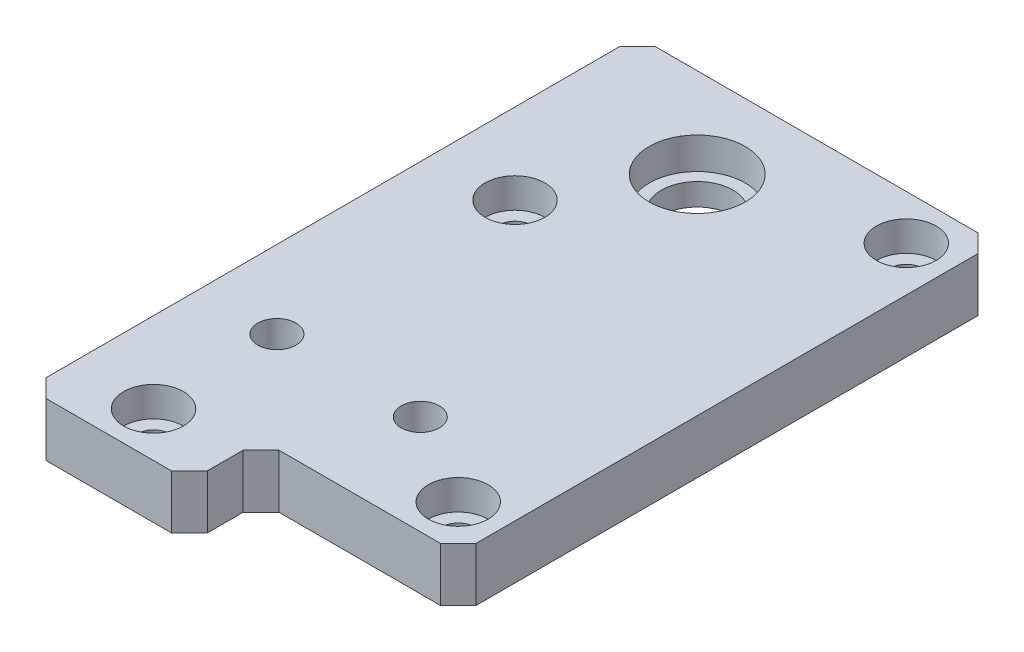
ISO-10303-21;
HEADER;
FILE_DESCRIPTION(('STEP AP214'),'2;1');
FILE_NAME('part.step','',(''),(''),'','','');
FILE_SCHEMA(('AUTOMOTIVE_DESIGN { 1 0 10303 214 1 1 1 1 }'));
ENDSEC;
DATA;
#1=APPLICATION_CONTEXT('core data for automotive mechanical design processes');
#2=APPLICATION_PROTOCOL_DEFINITION('international standard','automotive_design',2000,#1);
#3=PRODUCT_CONTEXT('',#1,'mechanical');
#4=PRODUCT('Part','Part','',(#3));
#5=PRODUCT_RELATED_PRODUCT_CATEGORY('part','',(#4));
#6=PRODUCT_DEFINITION_FORMATION('','',#4);
#7=PRODUCT_DEFINITION_CONTEXT('part definition',#1,'design');
#8=PRODUCT_DEFINITION('design','',#6,#7);
#9=PRODUCT_DEFINITION_SHAPE('','',#8);
#10=(LENGTH_UNIT() NAMED_UNIT(*) SI_UNIT(.MILLI.,.METRE.));
#11=(NAMED_UNIT(*) PLANE_ANGLE_UNIT() SI_UNIT($,.RADIAN.));
#12=(NAMED_UNIT(*) SI_UNIT($,.STERADIAN.) SOLID_ANGLE_UNIT());
#13=UNCERTAINTY_MEASURE_WITH_UNIT(LENGTH_MEASURE(1.E-05),#10,'distance_accuracy_value','');
#14=(GEOMETRIC_REPRESENTATION_CONTEXT(3) GLOBAL_UNCERTAINTY_ASSIGNED_CONTEXT((#13)) GLOBAL_UNIT_ASSIGNED_CONTEXT((#10,
#11,#12)) REPRESENTATION_CONTEXT('',''));
#15=CARTESIAN_POINT('',(0.,0.,0.));
#16=DIRECTION('',(0.,0.,1.));
#17=DIRECTION('',(1.,0.,0.));
#18=AXIS2_PLACEMENT_3D('',#15,#16,#17);
#19=CARTESIAN_POINT('',(0.,9.,0.));
#20=DIRECTION('',(0.,-1.,0.));
#21=DIRECTION('',(0.,0.,-1.));
#22=AXIS2_PLACEMENT_3D('',#19,#20,#21);
#23=PLANE('',#22);
#24=CARTESIAN_POINT('',(12.,9.,28.35));
#25=DIRECTION('',(0.,1.,0.));
#26=DIRECTION('',(0.,0.,1.));
#27=AXIS2_PLACEMENT_3D('',#24,#25,#26);
#28=CIRCLE('',#27,3.2);
#29=CARTESIAN_POINT('',(12.,9.,31.55));
#30=VERTEX_POINT('',#29);
#31=EDGE_CURVE('E305',#30,#30,#28,.T.);
#32=ORIENTED_EDGE('',*,*,#31,.F.);
#33=EDGE_LOOP('',(#32));
#34=FACE_BOUND('',#33,.T.);
#35=CARTESIAN_POINT('',(-12.,9.,28.35));
#36=DIRECTION('',(0.,1.,0.));
#37=DIRECTION('',(0.,0.,1.));
#38=AXIS2_PLACEMENT_3D('',#35,#36,#37);
#39=CIRCLE('',#38,3.2);
#40=CARTESIAN_POINT('',(-12.,9.,31.55));
#41=VERTEX_POINT('',#40);
#42=EDGE_CURVE('E302',#41,#41,#39,.T.);
#43=ORIENTED_EDGE('',*,*,#42,.F.);
#44=EDGE_LOOP('',(#43));
#45=FACE_BOUND('',#44,.T.);
#46=CARTESIAN_POINT('',(0.,9.,-30.));
#47=DIRECTION('',(0.,1.,0.));
#48=DIRECTION('',(0.,0.,1.));
#49=AXIS2_PLACEMENT_3D('',#46,#47,#48);
#50=CIRCLE('',#49,8.05);
#51=CARTESIAN_POINT('',(0.,9.,-21.95));
#52=VERTEX_POINT('',#51);
#53=EDGE_CURVE('E289',#52,#52,#50,.T.);
#54=ORIENTED_EDGE('',*,*,#53,.F.);
#55=EDGE_LOOP('',(#54));
#56=FACE_BOUND('',#55,.T.);
#57=CARTESIAN_POINT('',(27.5,9.,-37.5));
#58=DIRECTION('',(0.,1.,0.));
#59=DIRECTION('',(0.,0.,1.));
#60=AXIS2_PLACEMENT_3D('',#57,#58,#59);
#61=CIRCLE('',#60,5.);
#62=CARTESIAN_POINT('',(27.5,9.,-32.5));
#63=VERTEX_POINT('',#62);
#64=EDGE_CURVE('E283',#63,#63,#61,.T.);
#65=ORIENTED_EDGE('',*,*,#64,.F.);
#66=EDGE_LOOP('',(#65));
#67=FACE_BOUND('',#66,.T.);
#68=CARTESIAN_POINT('',(27.5,9.,37.5));
#69=DIRECTION('',(0.,1.,0.));
#70=DIRECTION('',(0.,0.,1.));
#71=AXIS2_PLACEMENT_3D('',#68,#69,#70);
#72=CIRCLE('',#71,5.);
#73=CARTESIAN_POINT('',(27.5,9.,42.5));
#74=VERTEX_POINT('',#73);
#75=EDGE_CURVE('E271',#74,#74,#72,.T.);
#76=ORIENTED_EDGE('',*,*,#75,.F.);
#77=EDGE_LOOP('',(#76));
#78=FACE_BOUND('',#77,.T.);
#79=CARTESIAN_POINT('',(-11.5,9.,-11.));
#80=DIRECTION('',(0.,1.,0.));
#81=DIRECTION('',(0.,0.,1.));
#82=AXIS2_PLACEMENT_3D('',#79,#80,#81);
#83=CIRCLE('',#82,5.);
#84=CARTESIAN_POINT('',(-11.5,9.,-6.));
#85=VERTEX_POINT('',#84);
#86=EDGE_CURVE('E259',#85,#85,#83,.T.);
#87=ORIENTED_EDGE('',*,*,#86,.F.);
#88=EDGE_LOOP('',(#87));
#89=FACE_BOUND('',#88,.T.);
#90=DIRECTION('',(0.,0.,-1.));
#91=VECTOR('',#90,1.);
#92=CARTESIAN_POINT('',(35.,9.,45.));
#93=LINE('',#92,#91);
#94=CARTESIAN_POINT('',(35.,9.,42.));
#95=VERTEX_POINT('',#94);
#96=CARTESIAN_POINT('',(35.,9.,-42.));
#97=VERTEX_POINT('',#96);
#98=EDGE_CURVE('E175',#95,#97,#93,.T.);
#99=ORIENTED_EDGE('',*,*,#98,.T.);
#100=DIRECTION('',(0.707106781186546,0.,0.707106781186549));
#101=VECTOR('',#100,1.);
#102=CARTESIAN_POINT('',(32.,9.,-45.));
#103=LINE('',#102,#101);
#104=CARTESIAN_POINT('',(32.,9.,-45.));
#105=VERTEX_POINT('',#104);
#106=EDGE_CURVE('E195',#97,#105,#103,.F.);
#107=ORIENTED_EDGE('',*,*,#106,.T.);
#108=DIRECTION('',(-1.,0.,0.));
#109=VECTOR('',#108,1.);
#110=CARTESIAN_POINT('',(-25.,9.,-45.));
#111=LINE('',#110,#109);
#112=CARTESIAN_POINT('',(-22.,9.,-45.));
#113=VERTEX_POINT('',#112);
#114=EDGE_CURVE('E151',#105,#113,#111,.T.);
#115=ORIENTED_EDGE('',*,*,#114,.T.);
#116=DIRECTION('',(0.707106781186549,0.,-0.707106781186546));
#117=VECTOR('',#116,1.);
#118=CARTESIAN_POINT('',(-25.,9.,-42.));
#119=LINE('',#118,#117);
#120=CARTESIAN_POINT('',(-25.,9.,-42.));
#121=VERTEX_POINT('',#120);
#122=EDGE_CURVE('E187',#113,#121,#119,.F.);
#123=ORIENTED_EDGE('',*,*,#122,.T.);
#124=DIRECTION('',(0.,0.,1.));
#125=VECTOR('',#124,1.);
#126=CARTESIAN_POINT('',(-25.,9.,-45.));
#127=LINE('',#126,#125);
#128=CARTESIAN_POINT('',(-25.,9.,54.));
#129=VERTEX_POINT('',#128);
#130=EDGE_CURVE('E233',#121,#129,#127,.T.);
#131=ORIENTED_EDGE('',*,*,#130,.T.);
#132=DIRECTION('',(-0.707106781186545,0.,-0.70710678118655));
#133=VECTOR('',#132,1.);
#134=CARTESIAN_POINT('',(-22.,9.,57.));
#135=LINE('',#134,#133);
#136=CARTESIAN_POINT('',(-22.,9.,57.));
#137=VERTEX_POINT('',#136);
#138=EDGE_CURVE('E189',#129,#137,#135,.F.);
#139=ORIENTED_EDGE('',*,*,#138,.T.);
#140=DIRECTION('',(1.,0.,0.));
#141=VECTOR('',#140,1.);
#142=CARTESIAN_POINT('',(-25.,9.,57.));
#143=LINE('',#142,#141);
#144=CARTESIAN_POINT('',(-0.999999999999984,9.,57.));
#145=VERTEX_POINT('',#144);
#146=EDGE_CURVE('E228',#137,#145,#143,.T.);
#147=ORIENTED_EDGE('',*,*,#146,.T.);
#148=DIRECTION('',(-0.707106781186549,0.,0.707106781186546));
#149=VECTOR('',#148,1.);
#150=CARTESIAN_POINT('',(2.00000000000002,9.,54.));
#151=LINE('',#150,#149);
#152=CARTESIAN_POINT('',(2.00000000000002,9.,54.));
#153=VERTEX_POINT('',#152);
#154=EDGE_CURVE('E191',#145,#153,#151,.F.);
#155=ORIENTED_EDGE('',*,*,#154,.T.);
#156=DIRECTION('',(0.,0.,-1.));
#157=VECTOR('',#156,1.);
#158=CARTESIAN_POINT('',(2.00000000000002,9.,57.));
#159=LINE('',#158,#157);
#160=CARTESIAN_POINT('',(2.00000000000002,9.,48.));
#161=VERTEX_POINT('',#160);
#162=EDGE_CURVE('E227',#153,#161,#159,.T.);
#163=ORIENTED_EDGE('',*,*,#162,.T.);
#164=DIRECTION('',(-0.707106781186552,0.,0.707106781186543));
#165=VECTOR('',#164,1.);
#166=CARTESIAN_POINT('',(25.,9.,25.0000000000003));
#167=LINE('',#166,#165);
#168=CARTESIAN_POINT('',(5.00000000000004,9.,45.));
#169=VERTEX_POINT('',#168);
#170=EDGE_CURVE('E11',#161,#169,#167,.F.);
#171=ORIENTED_EDGE('',*,*,#170,.T.);
#172=DIRECTION('',(1.,0.,0.));
#173=VECTOR('',#172,1.);
#174=CARTESIAN_POINT('',(2.00000000000002,9.,45.));
#175=LINE('',#174,#173);
#176=CARTESIAN_POINT('',(32.,9.,45.));
#177=VERTEX_POINT('',#176);
#178=EDGE_CURVE('E176',#169,#177,#175,.T.);
#179=ORIENTED_EDGE('',*,*,#178,.T.);
#180=DIRECTION('',(-0.707106781186549,0.,0.707106781186546));
#181=VECTOR('',#180,1.);
#182=CARTESIAN_POINT('',(35.,9.,42.));
#183=LINE('',#182,#181);
#184=EDGE_CURVE('E193',#177,#95,#183,.F.);
#185=ORIENTED_EDGE('',*,*,#184,.T.);
#186=EDGE_LOOP('',(#99,#107,#115,#123,#131,#139,#147,#155,#163,#171,#179,#185));
#187=FACE_BOUND('',#186,.T.);
#188=CARTESIAN_POINT('',(-11.5,9.,49.5));
#189=DIRECTION('',(0.,1.,0.));
#190=DIRECTION('',(0.,0.,1.));
#191=AXIS2_PLACEMENT_3D('',#188,#189,#190);
#192=CIRCLE('',#191,5.);
#193=CARTESIAN_POINT('',(-11.5,9.,54.5));
#194=VERTEX_POINT('',#193);
#195=EDGE_CURVE('E247',#194,#194,#192,.T.);
#196=ORIENTED_EDGE('',*,*,#195,.F.);
#197=EDGE_LOOP('',(#196));
#198=FACE_BOUND('',#197,.T.);
#199=ADVANCED_FACE('F41',(#34,#45,#56,#67,#78,#89,#187,#198),#23,.F.);
#200=CARTESIAN_POINT('',(0.,0.,0.));
#201=DIRECTION('',(0.,-1.,0.));
#202=DIRECTION('',(0.,0.,-1.));
#203=AXIS2_PLACEMENT_3D('',#200,#201,#202);
#204=PLANE('',#203);
#205=CARTESIAN_POINT('',(12.,0.,28.35));
#206=DIRECTION('',(0.,1.,0.));
#207=DIRECTION('',(0.,0.,1.));
#208=AXIS2_PLACEMENT_3D('',#205,#206,#207);
#209=CIRCLE('',#208,3.2);
#210=CARTESIAN_POINT('',(12.,0.,31.55));
#211=VERTEX_POINT('',#210);
#212=EDGE_CURVE('E298',#211,#211,#209,.T.);
#213=ORIENTED_EDGE('',*,*,#212,.T.);
#214=EDGE_LOOP('',(#213));
#215=FACE_BOUND('',#214,.T.);
#216=CARTESIAN_POINT('',(-12.,0.,28.35));
#217=DIRECTION('',(0.,1.,0.));
#218=DIRECTION('',(0.,0.,1.));
#219=AXIS2_PLACEMENT_3D('',#216,#217,#218);
#220=CIRCLE('',#219,3.2);
#221=CARTESIAN_POINT('',(-12.,0.,31.55));
#222=VERTEX_POINT('',#221);
#223=EDGE_CURVE('E299',#222,#222,#220,.T.);
#224=ORIENTED_EDGE('',*,*,#223,.T.);
#225=EDGE_LOOP('',(#224));
#226=FACE_BOUND('',#225,.T.);
#227=CARTESIAN_POINT('',(0.,0.,-30.));
#228=DIRECTION('',(0.,1.,0.));
#229=DIRECTION('',(0.,0.,1.));
#230=AXIS2_PLACEMENT_3D('',#227,#228,#229);
#231=CIRCLE('',#230,6.);
#232=CARTESIAN_POINT('',(0.,0.,-24.));
#233=VERTEX_POINT('',#232);
#234=EDGE_CURVE('E292',#233,#233,#231,.T.);
#235=ORIENTED_EDGE('',*,*,#234,.T.);
#236=EDGE_LOOP('',(#235));
#237=FACE_BOUND('',#236,.T.);
#238=CARTESIAN_POINT('',(27.5,0.,-37.5));
#239=DIRECTION('',(0.,1.,0.));
#240=DIRECTION('',(0.,0.,1.));
#241=AXIS2_PLACEMENT_3D('',#238,#239,#240);
#242=CIRCLE('',#241,2.75);
#243=CARTESIAN_POINT('',(27.5,0.,-34.75));
#244=VERTEX_POINT('',#243);
#245=EDGE_CURVE('E274',#244,#244,#242,.T.);
#246=ORIENTED_EDGE('',*,*,#245,.T.);
#247=EDGE_LOOP('',(#246));
#248=FACE_BOUND('',#247,.T.);
#249=CARTESIAN_POINT('',(27.5,0.,37.5));
#250=DIRECTION('',(0.,1.,0.));
#251=DIRECTION('',(0.,0.,1.));
#252=AXIS2_PLACEMENT_3D('',#249,#250,#251);
#253=CIRCLE('',#252,2.75);
#254=CARTESIAN_POINT('',(27.5,0.,40.25));
#255=VERTEX_POINT('',#254);
#256=EDGE_CURVE('E262',#255,#255,#253,.T.);
#257=ORIENTED_EDGE('',*,*,#256,.T.);
#258=EDGE_LOOP('',(#257));
#259=FACE_BOUND('',#258,.T.);
#260=CARTESIAN_POINT('',(-11.5,0.,-11.));
#261=DIRECTION('',(0.,1.,0.));
#262=DIRECTION('',(0.,0.,1.));
#263=AXIS2_PLACEMENT_3D('',#260,#261,#262);
#264=CIRCLE('',#263,2.75);
#265=CARTESIAN_POINT('',(-11.5,0.,-8.25));
#266=VERTEX_POINT('',#265);
#267=EDGE_CURVE('E250',#266,#266,#264,.T.);
#268=ORIENTED_EDGE('',*,*,#267,.T.);
#269=EDGE_LOOP('',(#268));
#270=FACE_BOUND('',#269,.T.);
#271=DIRECTION('',(-1.,0.,0.));
#272=VECTOR('',#271,1.);
#273=CARTESIAN_POINT('',(-25.,0.,-45.));
#274=LINE('',#273,#272);
#275=CARTESIAN_POINT('',(32.,0.,-45.));
#276=VERTEX_POINT('',#275);
#277=CARTESIAN_POINT('',(-22.,0.,-45.));
#278=VERTEX_POINT('',#277);
#279=EDGE_CURVE('E148',#276,#278,#274,.T.);
#280=ORIENTED_EDGE('',*,*,#279,.F.);
#281=DIRECTION('',(-0.707106781186546,0.,-0.707106781186549));
#282=VECTOR('',#281,1.);
#283=CARTESIAN_POINT('',(38.5000000000001,0.,-38.4999999999999));
#284=LINE('',#283,#282);
#285=CARTESIAN_POINT('',(35.,0.,-42.));
#286=VERTEX_POINT('',#285);
#287=EDGE_CURVE('E131',#276,#286,#284,.F.);
#288=ORIENTED_EDGE('',*,*,#287,.T.);
#289=DIRECTION('',(0.,0.,-1.));
#290=VECTOR('',#289,1.);
#291=CARTESIAN_POINT('',(35.,0.,45.));
#292=LINE('',#291,#290);
#293=CARTESIAN_POINT('',(35.,0.,42.));
#294=VERTEX_POINT('',#293);
#295=EDGE_CURVE('E159',#294,#286,#292,.T.);
#296=ORIENTED_EDGE('',*,*,#295,.F.);
#297=DIRECTION('',(0.707106781186549,0.,-0.707106781186546));
#298=VECTOR('',#297,1.);
#299=CARTESIAN_POINT('',(38.4999999999999,0.,38.5000000000001));
#300=LINE('',#299,#298);
#301=CARTESIAN_POINT('',(32.,0.,45.));
#302=VERTEX_POINT('',#301);
#303=EDGE_CURVE('E142',#294,#302,#300,.F.);
#304=ORIENTED_EDGE('',*,*,#303,.T.);
#305=DIRECTION('',(1.,0.,0.));
#306=VECTOR('',#305,1.);
#307=CARTESIAN_POINT('',(2.00000000000002,0.,45.));
#308=LINE('',#307,#306);
#309=CARTESIAN_POINT('',(5.00000000000004,0.,45.));
#310=VERTEX_POINT('',#309);
#311=EDGE_CURVE('E173',#310,#302,#308,.T.);
#312=ORIENTED_EDGE('',*,*,#311,.F.);
#313=DIRECTION('',(0.707106781186552,0.,-0.707106781186543));
#314=VECTOR('',#313,1.);
#315=CARTESIAN_POINT('',(5.00000000000004,0.,45.));
#316=LINE('',#315,#314);
#317=CARTESIAN_POINT('',(2.00000000000002,0.,48.));
#318=VERTEX_POINT('',#317);
#319=EDGE_CURVE('E50',#310,#318,#316,.F.);
#320=ORIENTED_EDGE('',*,*,#319,.T.);
#321=DIRECTION('',(0.,0.,-1.));
#322=VECTOR('',#321,1.);
#323=CARTESIAN_POINT('',(2.00000000000002,0.,57.));
#324=LINE('',#323,#322);
#325=CARTESIAN_POINT('',(2.00000000000002,0.,54.));
#326=VERTEX_POINT('',#325);
#327=EDGE_CURVE('E170',#326,#318,#324,.T.);
#328=ORIENTED_EDGE('',*,*,#327,.F.);
#329=DIRECTION('',(0.707106781186549,0.,-0.707106781186546));
#330=VECTOR('',#329,1.);
#331=CARTESIAN_POINT('',(28.,0.,28.0000000000001));
#332=LINE('',#331,#330);
#333=CARTESIAN_POINT('',(-0.999999999999984,0.,57.));
#334=VERTEX_POINT('',#333);
#335=EDGE_CURVE('E181',#326,#334,#332,.F.);
#336=ORIENTED_EDGE('',*,*,#335,.T.);
#337=DIRECTION('',(1.,0.,0.));
#338=VECTOR('',#337,1.);
#339=CARTESIAN_POINT('',(-25.,0.,57.));
#340=LINE('',#339,#338);
#341=CARTESIAN_POINT('',(-22.,0.,57.));
#342=VERTEX_POINT('',#341);
#343=EDGE_CURVE('E162',#342,#334,#340,.T.);
#344=ORIENTED_EDGE('',*,*,#343,.F.);
#345=DIRECTION('',(0.707106781186545,0.,0.70710678118655));
#346=VECTOR('',#345,1.);
#347=CARTESIAN_POINT('',(-39.5000000000001,0.,39.4999999999998));
#348=LINE('',#347,#346);
#349=CARTESIAN_POINT('',(-25.,0.,54.));
#350=VERTEX_POINT('',#349);
#351=EDGE_CURVE('E179',#342,#350,#348,.F.);
#352=ORIENTED_EDGE('',*,*,#351,.T.);
#353=DIRECTION('',(0.,0.,1.));
#354=VECTOR('',#353,1.);
#355=CARTESIAN_POINT('',(-25.,0.,-45.));
#356=LINE('',#355,#354);
#357=CARTESIAN_POINT('',(-25.,0.,-42.));
#358=VERTEX_POINT('',#357);
#359=EDGE_CURVE('E158',#358,#350,#356,.T.);
#360=ORIENTED_EDGE('',*,*,#359,.F.);
#361=DIRECTION('',(-0.707106781186549,0.,0.707106781186546));
#362=VECTOR('',#361,1.);
#363=CARTESIAN_POINT('',(-33.4999999999999,0.,-33.5000000000001));
#364=LINE('',#363,#362);
#365=EDGE_CURVE('E152',#358,#278,#364,.F.);
#366=ORIENTED_EDGE('',*,*,#365,.T.);
#367=EDGE_LOOP('',(#280,#288,#296,#304,#312,#320,#328,#336,#344,#352,#360,#366));
#368=FACE_BOUND('',#367,.T.);
#369=CARTESIAN_POINT('',(-11.5,0.,49.5));
#370=DIRECTION('',(0.,1.,0.));
#371=DIRECTION('',(0.,0.,1.));
#372=AXIS2_PLACEMENT_3D('',#369,#370,#371);
#373=CIRCLE('',#372,2.75);
#374=CARTESIAN_POINT('',(-11.5,0.,52.25));
#375=VERTEX_POINT('',#374);
#376=EDGE_CURVE('E164',#375,#375,#373,.T.);
#377=ORIENTED_EDGE('',*,*,#376,.T.);
#378=EDGE_LOOP('',(#377));
#379=FACE_BOUND('',#378,.T.);
#380=ADVANCED_FACE('F155',(#215,#226,#237,#248,#259,#270,#368,#379),#204,.T.);
#381=CARTESIAN_POINT('',(35.,9.,45.));
#382=DIRECTION('',(-1.,0.,0.));
#383=DIRECTION('',(0.,0.,1.));
#384=AXIS2_PLACEMENT_3D('',#381,#382,#383);
#385=PLANE('',#384);
#386=ORIENTED_EDGE('',*,*,#295,.T.);
#387=DIRECTION('',(0.,1.,0.));
#388=VECTOR('',#387,1.);
#389=CARTESIAN_POINT('',(35.,9.,-42.));
#390=LINE('',#389,#388);
#391=EDGE_CURVE('E136',#286,#97,#390,.T.);
#392=ORIENTED_EDGE('',*,*,#391,.T.);
#393=ORIENTED_EDGE('',*,*,#98,.F.);
#394=DIRECTION('',(0.,-1.,0.));
#395=VECTOR('',#394,1.);
#396=CARTESIAN_POINT('',(35.,9.,42.));
#397=LINE('',#396,#395);
#398=EDGE_CURVE('E141',#95,#294,#397,.T.);
#399=ORIENTED_EDGE('',*,*,#398,.T.);
#400=EDGE_LOOP('',(#386,#392,#393,#399));
#401=FACE_BOUND('',#400,.T.);
#402=ADVANCED_FACE('F360',(#401),#385,.F.);
#403=CARTESIAN_POINT('',(-25.,9.,-45.));
#404=DIRECTION('',(0.,0.,1.));
#405=DIRECTION('',(1.,0.,0.));
#406=AXIS2_PLACEMENT_3D('',#403,#404,#405);
#407=PLANE('',#406);
#408=ORIENTED_EDGE('',*,*,#114,.F.);
#409=DIRECTION('',(0.,-1.,0.));
#410=VECTOR('',#409,1.);
#411=CARTESIAN_POINT('',(32.,9.,-45.));
#412=LINE('',#411,#410);
#413=EDGE_CURVE('E135',#105,#276,#412,.T.);
#414=ORIENTED_EDGE('',*,*,#413,.T.);
#415=ORIENTED_EDGE('',*,*,#279,.T.);
#416=DIRECTION('',(0.,1.,0.));
#417=VECTOR('',#416,1.);
#418=CARTESIAN_POINT('',(-22.,9.,-45.));
#419=LINE('',#418,#417);
#420=EDGE_CURVE('E153',#278,#113,#419,.T.);
#421=ORIENTED_EDGE('',*,*,#420,.T.);
#422=EDGE_LOOP('',(#408,#414,#415,#421));
#423=FACE_BOUND('',#422,.T.);
#424=ADVANCED_FACE('F147',(#423),#407,.F.);
#425=CARTESIAN_POINT('',(-25.,9.,-45.));
#426=DIRECTION('',(1.,0.,0.));
#427=DIRECTION('',(0.,0.,-1.));
#428=AXIS2_PLACEMENT_3D('',#425,#426,#427);
#429=PLANE('',#428);
#430=ORIENTED_EDGE('',*,*,#359,.T.);
#431=DIRECTION('',(0.,1.,0.));
#432=VECTOR('',#431,1.);
#433=CARTESIAN_POINT('',(-25.,9.,54.));
#434=LINE('',#433,#432);
#435=EDGE_CURVE('E214',#350,#129,#434,.T.);
#436=ORIENTED_EDGE('',*,*,#435,.T.);
#437=ORIENTED_EDGE('',*,*,#130,.F.);
#438=DIRECTION('',(0.,-1.,0.));
#439=VECTOR('',#438,1.);
#440=CARTESIAN_POINT('',(-25.,9.,-42.));
#441=LINE('',#440,#439);
#442=EDGE_CURVE('E211',#121,#358,#441,.T.);
#443=ORIENTED_EDGE('',*,*,#442,.T.);
#444=EDGE_LOOP('',(#430,#436,#437,#443));
#445=FACE_BOUND('',#444,.T.);
#446=ADVANCED_FACE('F368',(#445),#429,.F.);
#447=CARTESIAN_POINT('',(-25.,9.,57.));
#448=DIRECTION('',(0.,0.,-1.));
#449=DIRECTION('',(-1.,0.,0.));
#450=AXIS2_PLACEMENT_3D('',#447,#448,#449);
#451=PLANE('',#450);
#452=ORIENTED_EDGE('',*,*,#343,.T.);
#453=DIRECTION('',(0.,1.,0.));
#454=VECTOR('',#453,1.);
#455=CARTESIAN_POINT('',(-0.999999999999984,9.,57.));
#456=LINE('',#455,#454);
#457=EDGE_CURVE('E209',#334,#145,#456,.T.);
#458=ORIENTED_EDGE('',*,*,#457,.T.);
#459=ORIENTED_EDGE('',*,*,#146,.F.);
#460=DIRECTION('',(0.,-1.,0.));
#461=VECTOR('',#460,1.);
#462=CARTESIAN_POINT('',(-22.,9.,57.));
#463=LINE('',#462,#461);
#464=EDGE_CURVE('E206',#137,#342,#463,.T.);
#465=ORIENTED_EDGE('',*,*,#464,.T.);
#466=EDGE_LOOP('',(#452,#458,#459,#465));
#467=FACE_BOUND('',#466,.T.);
#468=ADVANCED_FACE('F365',(#467),#451,.F.);
#469=CARTESIAN_POINT('',(2.00000000000002,9.,57.));
#470=DIRECTION('',(-1.,0.,0.));
#471=DIRECTION('',(0.,0.,1.));
#472=AXIS2_PLACEMENT_3D('',#469,#470,#471);
#473=PLANE('',#472);
#474=ORIENTED_EDGE('',*,*,#327,.T.);
#475=DIRECTION('',(0.,1.,0.));
#476=VECTOR('',#475,1.);
#477=CARTESIAN_POINT('',(2.00000000000002,9.,48.));
#478=LINE('',#477,#476);
#479=EDGE_CURVE('E204',#318,#161,#478,.T.);
#480=ORIENTED_EDGE('',*,*,#479,.T.);
#481=ORIENTED_EDGE('',*,*,#162,.F.);
#482=DIRECTION('',(0.,-1.,0.));
#483=VECTOR('',#482,1.);
#484=CARTESIAN_POINT('',(2.00000000000002,9.,54.));
#485=LINE('',#484,#483);
#486=EDGE_CURVE('E201',#153,#326,#485,.T.);
#487=ORIENTED_EDGE('',*,*,#486,.T.);
#488=EDGE_LOOP('',(#474,#480,#481,#487));
#489=FACE_BOUND('',#488,.T.);
#490=ADVANCED_FACE('F221',(#489),#473,.F.);
#491=CARTESIAN_POINT('',(2.00000000000002,9.,45.));
#492=DIRECTION('',(0.,0.,-1.));
#493=DIRECTION('',(-1.,0.,0.));
#494=AXIS2_PLACEMENT_3D('',#491,#492,#493);
#495=PLANE('',#494);
#496=ORIENTED_EDGE('',*,*,#311,.T.);
#497=DIRECTION('',(0.,1.,0.));
#498=VECTOR('',#497,1.);
#499=CARTESIAN_POINT('',(32.,9.,45.));
#500=LINE('',#499,#498);
#501=EDGE_CURVE('E57',#302,#177,#500,.T.);
#502=ORIENTED_EDGE('',*,*,#501,.T.);
#503=ORIENTED_EDGE('',*,*,#178,.F.);
#504=DIRECTION('',(0.,-1.,0.));
#505=VECTOR('',#504,1.);
#506=CARTESIAN_POINT('',(5.00000000000004,0.,45.));
#507=LINE('',#506,#505);
#508=EDGE_CURVE('E197',#169,#310,#507,.T.);
#509=ORIENTED_EDGE('',*,*,#508,.T.);
#510=EDGE_LOOP('',(#496,#502,#503,#509));
#511=FACE_BOUND('',#510,.T.);
#512=ADVANCED_FACE('F225',(#511),#495,.F.);
#513=CARTESIAN_POINT('',(-11.5,9.,49.5));
#514=DIRECTION('',(0.,1.,0.));
#515=DIRECTION('',(0.,0.,1.));
#516=AXIS2_PLACEMENT_3D('',#513,#514,#515);
#517=CYLINDRICAL_SURFACE('',#516,2.75);
#518=ORIENTED_EDGE('',*,*,#376,.F.);
#519=EDGE_LOOP('',(#518));
#520=FACE_BOUND('',#519,.T.);
#521=CARTESIAN_POINT('',(-11.5,4.,49.5));
#522=DIRECTION('',(0.,1.,0.));
#523=DIRECTION('',(0.,0.,1.));
#524=AXIS2_PLACEMENT_3D('',#521,#522,#523);
#525=CIRCLE('',#524,2.75);
#526=CARTESIAN_POINT('',(-11.5,4.,52.25));
#527=VERTEX_POINT('',#526);
#528=EDGE_CURVE('E241',#527,#527,#525,.T.);
#529=ORIENTED_EDGE('',*,*,#528,.T.);
#530=EDGE_LOOP('',(#529));
#531=FACE_BOUND('',#530,.T.);
#532=ADVANCED_FACE('F349',(#520,#531),#517,.F.);
#533=CARTESIAN_POINT('',(-8.74999999999998,4.,49.5));
#534=DIRECTION('',(0.,-1.,0.));
#535=DIRECTION('',(0.,0.,-1.));
#536=AXIS2_PLACEMENT_3D('',#533,#534,#535);
#537=PLANE('',#536);
#538=ORIENTED_EDGE('',*,*,#528,.F.);
#539=EDGE_LOOP('',(#538));
#540=FACE_BOUND('',#539,.T.);
#541=CARTESIAN_POINT('',(-11.5,4.,49.5));
#542=DIRECTION('',(0.,1.,0.));
#543=DIRECTION('',(0.,0.,1.));
#544=AXIS2_PLACEMENT_3D('',#541,#542,#543);
#545=CIRCLE('',#544,5.);
#546=CARTESIAN_POINT('',(-11.5,4.,54.5));
#547=VERTEX_POINT('',#546);
#548=EDGE_CURVE('E244',#547,#547,#545,.T.);
#549=ORIENTED_EDGE('',*,*,#548,.T.);
#550=EDGE_LOOP('',(#549));
#551=FACE_BOUND('',#550,.T.);
#552=ADVANCED_FACE('F339',(#540,#551),#537,.F.);
#553=CARTESIAN_POINT('',(-11.5,9.,49.5));
#554=DIRECTION('',(0.,1.,0.));
#555=DIRECTION('',(0.,0.,1.));
#556=AXIS2_PLACEMENT_3D('',#553,#554,#555);
#557=CYLINDRICAL_SURFACE('',#556,5.);
#558=ORIENTED_EDGE('',*,*,#548,.F.);
#559=EDGE_LOOP('',(#558));
#560=FACE_BOUND('',#559,.T.);
#561=ORIENTED_EDGE('',*,*,#195,.T.);
#562=EDGE_LOOP('',(#561));
#563=FACE_BOUND('',#562,.T.);
#564=ADVANCED_FACE('F336',(#560,#563),#557,.F.);
#565=CARTESIAN_POINT('',(-11.5,9.,-11.));
#566=DIRECTION('',(0.,1.,0.));
#567=DIRECTION('',(0.,0.,1.));
#568=AXIS2_PLACEMENT_3D('',#565,#566,#567);
#569=CYLINDRICAL_SURFACE('',#568,2.75);
#570=ORIENTED_EDGE('',*,*,#267,.F.);
#571=EDGE_LOOP('',(#570));
#572=FACE_BOUND('',#571,.T.);
#573=CARTESIAN_POINT('',(-11.5,4.,-11.));
#574=DIRECTION('',(0.,1.,0.));
#575=DIRECTION('',(0.,0.,1.));
#576=AXIS2_PLACEMENT_3D('',#573,#574,#575);
#577=CIRCLE('',#576,2.75);
#578=CARTESIAN_POINT('',(-11.5,4.,-8.25));
#579=VERTEX_POINT('',#578);
#580=EDGE_CURVE('E253',#579,#579,#577,.T.);
#581=ORIENTED_EDGE('',*,*,#580,.T.);
#582=EDGE_LOOP('',(#581));
#583=FACE_BOUND('',#582,.T.);
#584=ADVANCED_FACE('F338',(#572,#583),#569,.F.);
#585=CARTESIAN_POINT('',(-8.74999999999998,4.,-11.));
#586=DIRECTION('',(0.,-1.,0.));
#587=DIRECTION('',(0.,0.,-1.));
#588=AXIS2_PLACEMENT_3D('',#585,#586,#587);
#589=PLANE('',#588);
#590=ORIENTED_EDGE('',*,*,#580,.F.);
#591=EDGE_LOOP('',(#590));
#592=FACE_BOUND('',#591,.T.);
#593=CARTESIAN_POINT('',(-11.5,4.,-11.));
#594=DIRECTION('',(0.,1.,0.));
#595=DIRECTION('',(0.,0.,1.));
#596=AXIS2_PLACEMENT_3D('',#593,#594,#595);
#597=CIRCLE('',#596,5.);
#598=CARTESIAN_POINT('',(-11.5,4.,-6.));
#599=VERTEX_POINT('',#598);
#600=EDGE_CURVE('E256',#599,#599,#597,.T.);
#601=ORIENTED_EDGE('',*,*,#600,.T.);
#602=EDGE_LOOP('',(#601));
#603=FACE_BOUND('',#602,.T.);
#604=ADVANCED_FACE('F346',(#592,#603),#589,.F.);
#605=CARTESIAN_POINT('',(-11.5,9.,-11.));
#606=DIRECTION('',(0.,1.,0.));
#607=DIRECTION('',(0.,0.,1.));
#608=AXIS2_PLACEMENT_3D('',#605,#606,#607);
#609=CYLINDRICAL_SURFACE('',#608,5.);
#610=ORIENTED_EDGE('',*,*,#600,.F.);
#611=EDGE_LOOP('',(#610));
#612=FACE_BOUND('',#611,.T.);
#613=ORIENTED_EDGE('',*,*,#86,.T.);
#614=EDGE_LOOP('',(#613));
#615=FACE_BOUND('',#614,.T.);
#616=ADVANCED_FACE('F557',(#612,#615),#609,.F.);
#617=CARTESIAN_POINT('',(27.5,9.,37.5));
#618=DIRECTION('',(0.,1.,0.));
#619=DIRECTION('',(0.,0.,1.));
#620=AXIS2_PLACEMENT_3D('',#617,#618,#619);
#621=CYLINDRICAL_SURFACE('',#620,2.75);
#622=ORIENTED_EDGE('',*,*,#256,.F.);
#623=EDGE_LOOP('',(#622));
#624=FACE_BOUND('',#623,.T.);
#625=CARTESIAN_POINT('',(27.5,4.,37.5));
#626=DIRECTION('',(0.,1.,0.));
#627=DIRECTION('',(0.,0.,1.));
#628=AXIS2_PLACEMENT_3D('',#625,#626,#627);
#629=CIRCLE('',#628,2.75);
#630=CARTESIAN_POINT('',(27.5,4.,40.25));
#631=VERTEX_POINT('',#630);
#632=EDGE_CURVE('E265',#631,#631,#629,.T.);
#633=ORIENTED_EDGE('',*,*,#632,.T.);
#634=EDGE_LOOP('',(#633));
#635=FACE_BOUND('',#634,.T.);
#636=ADVANCED_FACE('F547',(#624,#635),#621,.F.);
#637=CARTESIAN_POINT('',(30.25,4.,37.5));
#638=DIRECTION('',(0.,-1.,0.));
#639=DIRECTION('',(0.,0.,-1.));
#640=AXIS2_PLACEMENT_3D('',#637,#638,#639);
#641=PLANE('',#640);
#642=ORIENTED_EDGE('',*,*,#632,.F.);
#643=EDGE_LOOP('',(#642));
#644=FACE_BOUND('',#643,.T.);
#645=CARTESIAN_POINT('',(27.5,4.,37.5));
#646=DIRECTION('',(0.,1.,0.));
#647=DIRECTION('',(0.,0.,1.));
#648=AXIS2_PLACEMENT_3D('',#645,#646,#647);
#649=CIRCLE('',#648,5.);
#650=CARTESIAN_POINT('',(27.5,4.,42.5));
#651=VERTEX_POINT('',#650);
#652=EDGE_CURVE('E268',#651,#651,#649,.T.);
#653=ORIENTED_EDGE('',*,*,#652,.T.);
#654=EDGE_LOOP('',(#653));
#655=FACE_BOUND('',#654,.T.);
#656=ADVANCED_FACE('F537',(#644,#655),#641,.F.);
#657=CARTESIAN_POINT('',(27.5,9.,37.5));
#658=DIRECTION('',(0.,1.,0.));
#659=DIRECTION('',(0.,0.,1.));
#660=AXIS2_PLACEMENT_3D('',#657,#658,#659);
#661=CYLINDRICAL_SURFACE('',#660,5.);
#662=ORIENTED_EDGE('',*,*,#652,.F.);
#663=EDGE_LOOP('',(#662));
#664=FACE_BOUND('',#663,.T.);
#665=ORIENTED_EDGE('',*,*,#75,.T.);
#666=EDGE_LOOP('',(#665));
#667=FACE_BOUND('',#666,.T.);
#668=ADVANCED_FACE('F527',(#664,#667),#661,.F.);
#669=CARTESIAN_POINT('',(27.5,9.,-37.5));
#670=DIRECTION('',(0.,1.,0.));
#671=DIRECTION('',(0.,0.,1.));
#672=AXIS2_PLACEMENT_3D('',#669,#670,#671);
#673=CYLINDRICAL_SURFACE('',#672,2.75);
#674=ORIENTED_EDGE('',*,*,#245,.F.);
#675=EDGE_LOOP('',(#674));
#676=FACE_BOUND('',#675,.T.);
#677=CARTESIAN_POINT('',(27.5,4.,-37.5));
#678=DIRECTION('',(0.,1.,0.));
#679=DIRECTION('',(0.,0.,1.));
#680=AXIS2_PLACEMENT_3D('',#677,#678,#679);
#681=CIRCLE('',#680,2.75);
#682=CARTESIAN_POINT('',(27.5,4.,-34.75));
#683=VERTEX_POINT('',#682);
#684=EDGE_CURVE('E277',#683,#683,#681,.T.);
#685=ORIENTED_EDGE('',*,*,#684,.T.);
#686=EDGE_LOOP('',(#685));
#687=FACE_BOUND('',#686,.T.);
#688=ADVANCED_FACE('F517',(#676,#687),#673,.F.);
#689=CARTESIAN_POINT('',(30.25,4.,-37.5));
#690=DIRECTION('',(0.,-1.,0.));
#691=DIRECTION('',(0.,0.,-1.));
#692=AXIS2_PLACEMENT_3D('',#689,#690,#691);
#693=PLANE('',#692);
#694=ORIENTED_EDGE('',*,*,#684,.F.);
#695=EDGE_LOOP('',(#694));
#696=FACE_BOUND('',#695,.T.);
#697=CARTESIAN_POINT('',(27.5,4.,-37.5));
#698=DIRECTION('',(0.,1.,0.));
#699=DIRECTION('',(0.,0.,1.));
#700=AXIS2_PLACEMENT_3D('',#697,#698,#699);
#701=CIRCLE('',#700,5.);
#702=CARTESIAN_POINT('',(27.5,4.,-32.5));
#703=VERTEX_POINT('',#702);
#704=EDGE_CURVE('E280',#703,#703,#701,.T.);
#705=ORIENTED_EDGE('',*,*,#704,.T.);
#706=EDGE_LOOP('',(#705));
#707=FACE_BOUND('',#706,.T.);
#708=ADVANCED_FACE('F507',(#696,#707),#693,.F.);
#709=CARTESIAN_POINT('',(27.5,9.,-37.5));
#710=DIRECTION('',(0.,1.,0.));
#711=DIRECTION('',(0.,0.,1.));
#712=AXIS2_PLACEMENT_3D('',#709,#710,#711);
#713=CYLINDRICAL_SURFACE('',#712,5.);
#714=ORIENTED_EDGE('',*,*,#704,.F.);
#715=EDGE_LOOP('',(#714));
#716=FACE_BOUND('',#715,.T.);
#717=ORIENTED_EDGE('',*,*,#64,.T.);
#718=EDGE_LOOP('',(#717));
#719=FACE_BOUND('',#718,.T.);
#720=ADVANCED_FACE('F498',(#716,#719),#713,.F.);
#721=CARTESIAN_POINT('',(0.,3.7,-30.));
#722=DIRECTION('',(0.,-1.,0.));
#723=DIRECTION('',(0.,0.,-1.));
#724=AXIS2_PLACEMENT_3D('',#721,#722,#723);
#725=PLANE('',#724);
#726=CARTESIAN_POINT('',(0.,3.7,-30.));
#727=DIRECTION('',(0.,1.,0.));
#728=DIRECTION('',(0.,0.,1.));
#729=AXIS2_PLACEMENT_3D('',#726,#727,#728);
#730=CIRCLE('',#729,5.99999999999999);
#731=CARTESIAN_POINT('',(0.,3.7,-24.));
#732=VERTEX_POINT('',#731);
#733=EDGE_CURVE('E295',#732,#732,#730,.T.);
#734=ORIENTED_EDGE('',*,*,#733,.F.);
#735=EDGE_LOOP('',(#734));
#736=FACE_BOUND('',#735,.T.);
#737=CARTESIAN_POINT('',(0.,3.7,-30.));
#738=DIRECTION('',(0.,1.,0.));
#739=DIRECTION('',(0.,0.,1.));
#740=AXIS2_PLACEMENT_3D('',#737,#738,#739);
#741=CIRCLE('',#740,8.05);
#742=CARTESIAN_POINT('',(0.,3.7,-21.95));
#743=VERTEX_POINT('',#742);
#744=EDGE_CURVE('E286',#743,#743,#741,.T.);
#745=ORIENTED_EDGE('',*,*,#744,.T.);
#746=EDGE_LOOP('',(#745));
#747=FACE_BOUND('',#746,.T.);
#748=ADVANCED_FACE('F488',(#736,#747),#725,.F.);
#749=CARTESIAN_POINT('',(0.,9.,-30.));
#750=DIRECTION('',(0.,1.,0.));
#751=DIRECTION('',(0.,0.,1.));
#752=AXIS2_PLACEMENT_3D('',#749,#750,#751);
#753=CYLINDRICAL_SURFACE('',#752,8.05);
#754=ORIENTED_EDGE('',*,*,#744,.F.);
#755=EDGE_LOOP('',(#754));
#756=FACE_BOUND('',#755,.T.);
#757=ORIENTED_EDGE('',*,*,#53,.T.);
#758=EDGE_LOOP('',(#757));
#759=FACE_BOUND('',#758,.T.);
#760=ADVANCED_FACE('F477',(#756,#759),#753,.F.);
#761=CARTESIAN_POINT('',(0.,3.7,-30.));
#762=DIRECTION('',(0.,1.,0.));
#763=DIRECTION('',(0.,0.,1.));
#764=AXIS2_PLACEMENT_3D('',#761,#762,#763);
#765=CYLINDRICAL_SURFACE('',#764,5.99999999999999);
#766=ORIENTED_EDGE('',*,*,#234,.F.);
#767=EDGE_LOOP('',(#766));
#768=FACE_BOUND('',#767,.T.);
#769=ORIENTED_EDGE('',*,*,#733,.T.);
#770=EDGE_LOOP('',(#769));
#771=FACE_BOUND('',#770,.T.);
#772=ADVANCED_FACE('F467',(#768,#771),#765,.F.);
#773=CARTESIAN_POINT('',(-12.,0.,28.35));
#774=DIRECTION('',(0.,1.,0.));
#775=DIRECTION('',(0.,0.,1.));
#776=AXIS2_PLACEMENT_3D('',#773,#774,#775);
#777=CYLINDRICAL_SURFACE('',#776,3.2);
#778=ORIENTED_EDGE('',*,*,#223,.F.);
#779=EDGE_LOOP('',(#778));
#780=FACE_BOUND('',#779,.T.);
#781=ORIENTED_EDGE('',*,*,#42,.T.);
#782=EDGE_LOOP('',(#781));
#783=FACE_BOUND('',#782,.T.);
#784=ADVANCED_FACE('F316',(#780,#783),#777,.F.);
#785=CARTESIAN_POINT('',(12.,0.,28.35));
#786=DIRECTION('',(0.,1.,0.));
#787=DIRECTION('',(0.,0.,1.));
#788=AXIS2_PLACEMENT_3D('',#785,#786,#787);
#789=CYLINDRICAL_SURFACE('',#788,3.2);
#790=ORIENTED_EDGE('',*,*,#212,.F.);
#791=EDGE_LOOP('',(#790));
#792=FACE_BOUND('',#791,.T.);
#793=ORIENTED_EDGE('',*,*,#31,.T.);
#794=EDGE_LOOP('',(#793));
#795=FACE_BOUND('',#794,.T.);
#796=ADVANCED_FACE('F313',(#792,#795),#789,.F.);
#797=CARTESIAN_POINT('',(32.,9.,-45.));
#798=DIRECTION('',(-0.707106781186549,0.,0.707106781186546));
#799=DIRECTION('',(0.,-1.,0.));
#800=AXIS2_PLACEMENT_3D('',#797,#798,#799);
#801=PLANE('',#800);
#802=ORIENTED_EDGE('',*,*,#106,.F.);
#803=ORIENTED_EDGE('',*,*,#391,.F.);
#804=ORIENTED_EDGE('',*,*,#287,.F.);
#805=ORIENTED_EDGE('',*,*,#413,.F.);
#806=EDGE_LOOP('',(#802,#803,#804,#805));
#807=FACE_BOUND('',#806,.T.);
#808=ADVANCED_FACE('F134',(#807),#801,.F.);
#809=CARTESIAN_POINT('',(35.,9.,42.));
#810=DIRECTION('',(-0.707106781186546,0.,-0.707106781186549));
#811=DIRECTION('',(0.,-1.,0.));
#812=AXIS2_PLACEMENT_3D('',#809,#810,#811);
#813=PLANE('',#812);
#814=ORIENTED_EDGE('',*,*,#184,.F.);
#815=ORIENTED_EDGE('',*,*,#501,.F.);
#816=ORIENTED_EDGE('',*,*,#303,.F.);
#817=ORIENTED_EDGE('',*,*,#398,.F.);
#818=EDGE_LOOP('',(#814,#815,#816,#817));
#819=FACE_BOUND('',#818,.T.);
#820=ADVANCED_FACE('F384',(#819),#813,.F.);
#821=CARTESIAN_POINT('',(5.00000000000004,9.,45.));
#822=DIRECTION('',(0.707106781186543,0.,0.707106781186552));
#823=DIRECTION('',(0.,1.,0.));
#824=AXIS2_PLACEMENT_3D('',#821,#822,#823);
#825=PLANE('',#824);
#826=ORIENTED_EDGE('',*,*,#170,.F.);
#827=ORIENTED_EDGE('',*,*,#479,.F.);
#828=ORIENTED_EDGE('',*,*,#319,.F.);
#829=ORIENTED_EDGE('',*,*,#508,.F.);
#830=EDGE_LOOP('',(#826,#827,#828,#829));
#831=FACE_BOUND('',#830,.T.);
#832=ADVANCED_FACE('F224',(#831),#825,.T.);
#833=CARTESIAN_POINT('',(2.00000000000002,9.,54.));
#834=DIRECTION('',(-0.707106781186546,0.,-0.707106781186549));
#835=DIRECTION('',(0.,-1.,0.));
#836=AXIS2_PLACEMENT_3D('',#833,#834,#835);
#837=PLANE('',#836);
#838=ORIENTED_EDGE('',*,*,#154,.F.);
#839=ORIENTED_EDGE('',*,*,#457,.F.);
#840=ORIENTED_EDGE('',*,*,#335,.F.);
#841=ORIENTED_EDGE('',*,*,#486,.F.);
#842=EDGE_LOOP('',(#838,#839,#840,#841));
#843=FACE_BOUND('',#842,.T.);
#844=ADVANCED_FACE('F396',(#843),#837,.F.);
#845=CARTESIAN_POINT('',(-22.,9.,57.));
#846=DIRECTION('',(0.70710678118655,0.,-0.707106781186545));
#847=DIRECTION('',(0.,-1.,0.));
#848=AXIS2_PLACEMENT_3D('',#845,#846,#847);
#849=PLANE('',#848);
#850=ORIENTED_EDGE('',*,*,#138,.F.);
#851=ORIENTED_EDGE('',*,*,#435,.F.);
#852=ORIENTED_EDGE('',*,*,#351,.F.);
#853=ORIENTED_EDGE('',*,*,#464,.F.);
#854=EDGE_LOOP('',(#850,#851,#852,#853));
#855=FACE_BOUND('',#854,.T.);
#856=ADVANCED_FACE('F401',(#855),#849,.F.);
#857=CARTESIAN_POINT('',(-25.,9.,-42.));
#858=DIRECTION('',(0.707106781186546,0.,0.707106781186549));
#859=DIRECTION('',(0.,-1.,0.));
#860=AXIS2_PLACEMENT_3D('',#857,#858,#859);
#861=PLANE('',#860);
#862=ORIENTED_EDGE('',*,*,#122,.F.);
#863=ORIENTED_EDGE('',*,*,#420,.F.);
#864=ORIENTED_EDGE('',*,*,#365,.F.);
#865=ORIENTED_EDGE('',*,*,#442,.F.);
#866=EDGE_LOOP('',(#862,#863,#864,#865));
#867=FACE_BOUND('',#866,.T.);
#868=ADVANCED_FACE('F44',(#867),#861,.F.);
#869=CLOSED_SHELL('',(#199,#380,#402,#424,#446,#468,#490,#512,#532,#552,#564,#584,#604,#616,
#636,#656,#668,#688,#708,#720,#748,#760,#772,#784,#796,#808,#820,#832,#844,#856,#868));
#870=MANIFOLD_SOLID_BREP('B2',#869);
#871=ADVANCED_BREP_SHAPE_REPRESENTATION('',(#18,#870),#14);
#872=SHAPE_DEFINITION_REPRESENTATION(#9,#871);
ENDSEC;
END-ISO-10303-21;
